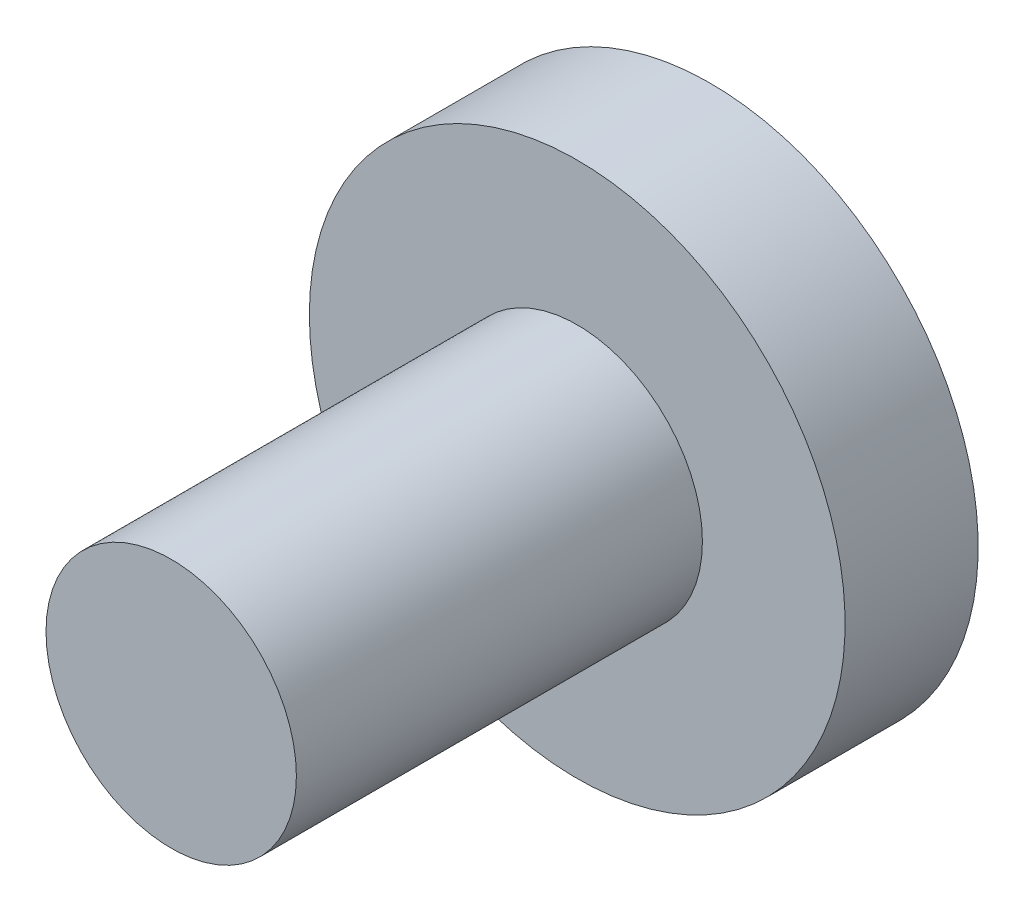
ISO-10303-21;
HEADER;
FILE_DESCRIPTION(('STEP AP214'),'2;1');
FILE_NAME('part.step','',(''),(''),'','','');
FILE_SCHEMA(('AUTOMOTIVE_DESIGN { 1 0 10303 214 1 1 1 1 }'));
ENDSEC;
DATA;
#1=APPLICATION_CONTEXT('core data for automotive mechanical design processes');
#2=APPLICATION_PROTOCOL_DEFINITION('international standard','automotive_design',2000,#1);
#3=PRODUCT_CONTEXT('',#1,'mechanical');
#4=PRODUCT('Part','Part','',(#3));
#5=PRODUCT_RELATED_PRODUCT_CATEGORY('part','',(#4));
#6=PRODUCT_DEFINITION_FORMATION('','',#4);
#7=PRODUCT_DEFINITION_CONTEXT('part definition',#1,'design');
#8=PRODUCT_DEFINITION('design','',#6,#7);
#9=PRODUCT_DEFINITION_SHAPE('','',#8);
#10=(LENGTH_UNIT() NAMED_UNIT(*) SI_UNIT(.MILLI.,.METRE.));
#11=(NAMED_UNIT(*) PLANE_ANGLE_UNIT() SI_UNIT($,.RADIAN.));
#12=(NAMED_UNIT(*) SI_UNIT($,.STERADIAN.) SOLID_ANGLE_UNIT());
#13=UNCERTAINTY_MEASURE_WITH_UNIT(LENGTH_MEASURE(1.E-05),#10,'distance_accuracy_value','');
#14=(GEOMETRIC_REPRESENTATION_CONTEXT(3) GLOBAL_UNCERTAINTY_ASSIGNED_CONTEXT((#13)) GLOBAL_UNIT_ASSIGNED_CONTEXT((#10,
#11,#12)) REPRESENTATION_CONTEXT('',''));
#15=CARTESIAN_POINT('',(0.,0.,0.));
#16=DIRECTION('',(0.,0.,1.));
#17=DIRECTION('',(1.,0.,0.));
#18=AXIS2_PLACEMENT_3D('',#15,#16,#17);
#19=CARTESIAN_POINT('',(-3.56925029485083,4.79469753857648,2.9972));
#20=DIRECTION('',(0.,0.,-1.));
#21=DIRECTION('',(-1.,0.,0.));
#22=AXIS2_PLACEMENT_3D('',#19,#20,#21);
#23=CYLINDRICAL_SURFACE('',#22,6.0325);
#24=CARTESIAN_POINT('',(-3.56925029485083,4.79469753857648,2.9972));
#25=DIRECTION('',(0.,0.,1.));
#26=DIRECTION('',(1.,0.,0.));
#27=AXIS2_PLACEMENT_3D('',#24,#25,#26);
#28=CIRCLE('',#27,6.0325);
#29=CARTESIAN_POINT('',(-9.60175029485083,4.79469753857648,2.9972));
#30=VERTEX_POINT('',#29);
#31=EDGE_CURVE('E10',#30,#30,#28,.T.);
#32=CARTESIAN_POINT('',(-3.56925029485083,4.79469753857648,0.));
#33=DIRECTION('',(0.,0.,1.));
#34=DIRECTION('',(1.,0.,0.));
#35=AXIS2_PLACEMENT_3D('',#32,#33,#34);
#36=CIRCLE('',#35,6.0325);
#37=CARTESIAN_POINT('',(-9.60175029485083,4.79469753857648,0.));
#38=VERTEX_POINT('',#37);
#39=EDGE_CURVE('E36',#38,#38,#36,.T.);
#40=CARTESIAN_POINT('',(-9.60175029485083,4.79469753857648,2.9972));
#41=CARTESIAN_POINT('',(-9.60175029485083,4.79469753857648,2.96597916666667));
#42=CARTESIAN_POINT('',(-9.60175029485083,4.79469753857648,2.93475833333333));
#43=CARTESIAN_POINT('',(-9.60175029485083,4.79469753857648,2.87231666666667));
#44=CARTESIAN_POINT('',(-9.60175029485083,4.79469753857648,2.84109583333333));
#45=CARTESIAN_POINT('',(-9.60175029485083,4.79469753857648,2.77865416666667));
#46=CARTESIAN_POINT('',(-9.60175029485083,4.79469753857648,2.74743333333333));
#47=CARTESIAN_POINT('',(-9.60175029485083,4.79469753857648,2.68499166666667));
#48=CARTESIAN_POINT('',(-9.60175029485083,4.79469753857648,2.65377083333333));
#49=CARTESIAN_POINT('',(-9.60175029485083,4.79469753857648,2.59132916666667));
#50=CARTESIAN_POINT('',(-9.60175029485083,4.79469753857648,2.56010833333333));
#51=CARTESIAN_POINT('',(-9.60175029485083,4.79469753857648,2.49766666666667));
#52=CARTESIAN_POINT('',(-9.60175029485083,4.79469753857648,2.46644583333333));
#53=CARTESIAN_POINT('',(-9.60175029485083,4.79469753857648,2.40400416666667));
#54=CARTESIAN_POINT('',(-9.60175029485083,4.79469753857648,2.37278333333333));
#55=CARTESIAN_POINT('',(-9.60175029485083,4.79469753857648,2.31034166666667));
#56=CARTESIAN_POINT('',(-9.60175029485083,4.79469753857648,2.27912083333333));
#57=CARTESIAN_POINT('',(-9.60175029485083,4.79469753857648,2.21667916666667));
#58=CARTESIAN_POINT('',(-9.60175029485083,4.79469753857648,2.18545833333333));
#59=CARTESIAN_POINT('',(-9.60175029485083,4.79469753857648,2.12301666666667));
#60=CARTESIAN_POINT('',(-9.60175029485083,4.79469753857648,2.09179583333333));
#61=CARTESIAN_POINT('',(-9.60175029485083,4.79469753857648,2.02935416666667));
#62=CARTESIAN_POINT('',(-9.60175029485083,4.79469753857648,1.99813333333333));
#63=CARTESIAN_POINT('',(-9.60175029485083,4.79469753857648,1.93569166666667));
#64=CARTESIAN_POINT('',(-9.60175029485083,4.79469753857648,1.90447083333333));
#65=CARTESIAN_POINT('',(-9.60175029485083,4.79469753857648,1.84202916666667));
#66=CARTESIAN_POINT('',(-9.60175029485083,4.79469753857648,1.81080833333333));
#67=CARTESIAN_POINT('',(-9.60175029485083,4.79469753857648,1.74836666666667));
#68=CARTESIAN_POINT('',(-9.60175029485083,4.79469753857648,1.71714583333333));
#69=CARTESIAN_POINT('',(-9.60175029485083,4.79469753857648,1.65470416666667));
#70=CARTESIAN_POINT('',(-9.60175029485083,4.79469753857648,1.62348333333333));
#71=CARTESIAN_POINT('',(-9.60175029485083,4.79469753857648,1.56104166666667));
#72=CARTESIAN_POINT('',(-9.60175029485083,4.79469753857648,1.52982083333333));
#73=CARTESIAN_POINT('',(-9.60175029485083,4.79469753857648,1.46737916666667));
#74=CARTESIAN_POINT('',(-9.60175029485083,4.79469753857648,1.43615833333333));
#75=CARTESIAN_POINT('',(-9.60175029485083,4.79469753857648,1.37371666666667));
#76=CARTESIAN_POINT('',(-9.60175029485083,4.79469753857648,1.34249583333333));
#77=CARTESIAN_POINT('',(-9.60175029485083,4.79469753857648,1.28005416666667));
#78=CARTESIAN_POINT('',(-9.60175029485083,4.79469753857648,1.24883333333333));
#79=CARTESIAN_POINT('',(-9.60175029485083,4.79469753857648,1.18639166666667));
#80=CARTESIAN_POINT('',(-9.60175029485083,4.79469753857648,1.15517083333333));
#81=CARTESIAN_POINT('',(-9.60175029485083,4.79469753857648,1.09272916666667));
#82=CARTESIAN_POINT('',(-9.60175029485083,4.79469753857648,1.06150833333333));
#83=CARTESIAN_POINT('',(-9.60175029485083,4.79469753857648,0.999066666666667));
#84=CARTESIAN_POINT('',(-9.60175029485083,4.79469753857648,0.967845833333333));
#85=CARTESIAN_POINT('',(-9.60175029485083,4.79469753857648,0.905404166666667));
#86=CARTESIAN_POINT('',(-9.60175029485083,4.79469753857648,0.874183333333333));
#87=CARTESIAN_POINT('',(-9.60175029485083,4.79469753857648,0.811741666666667));
#88=CARTESIAN_POINT('',(-9.60175029485083,4.79469753857648,0.780520833333333));
#89=CARTESIAN_POINT('',(-9.60175029485083,4.79469753857648,0.718079166666667));
#90=CARTESIAN_POINT('',(-9.60175029485083,4.79469753857648,0.686858333333333));
#91=CARTESIAN_POINT('',(-9.60175029485083,4.79469753857648,0.624416666666667));
#92=CARTESIAN_POINT('',(-9.60175029485083,4.79469753857648,0.593195833333333));
#93=CARTESIAN_POINT('',(-9.60175029485083,4.79469753857648,0.530754166666667));
#94=CARTESIAN_POINT('',(-9.60175029485083,4.79469753857648,0.499533333333333));
#95=CARTESIAN_POINT('',(-9.60175029485083,4.79469753857648,0.437091666666667));
#96=CARTESIAN_POINT('',(-9.60175029485083,4.79469753857648,0.405870833333333));
#97=CARTESIAN_POINT('',(-9.60175029485083,4.79469753857648,0.343429166666667));
#98=CARTESIAN_POINT('',(-9.60175029485083,4.79469753857648,0.312208333333333));
#99=CARTESIAN_POINT('',(-9.60175029485083,4.79469753857648,0.249766666666667));
#100=CARTESIAN_POINT('',(-9.60175029485083,4.79469753857648,0.218545833333333));
#101=CARTESIAN_POINT('',(-9.60175029485083,4.79469753857648,0.156104166666667));
#102=CARTESIAN_POINT('',(-9.60175029485083,4.79469753857648,0.124883333333333));
#103=CARTESIAN_POINT('',(-9.60175029485083,4.79469753857648,0.0624416666666668));
#104=CARTESIAN_POINT('',(-9.60175029485083,4.79469753857648,0.0312208333333333));
#105=CARTESIAN_POINT('',(-9.60175029485083,4.79469753857648,0.));
#106=B_SPLINE_CURVE_WITH_KNOTS('',3,(#40,#41,#42,#43,#44,#45,#46,#47,#48,#49,#50,#51,#52,#53,
#54,#55,#56,#57,#58,#59,#60,#61,#62,#63,#64,#65,#66,#67,#68,#69,#70,#71,#72,#73,#74,#75,#76,#77,
#78,#79,#80,#81,#82,#83,#84,#85,#86,#87,#88,#89,#90,#91,#92,#93,#94,#95,#96,#97,#98,#99,#100,
#101,#102,#103,#104,#105),.UNSPECIFIED.,.F.,.F.,(4,2,2,2,2,2,2,2,2,2,2,2,2,2,2,2,2,2,2,2,2,2,2,
2,2,2,2,2,2,2,2,2,4),(0.,0.0936625000000002,0.187325,0.2809875,0.37465,0.4683125,0.561975,
0.6556375,0.7493,0.8429625,0.936625,1.0302875,1.12395,1.2176125,1.311275,1.4049375,1.4986,
1.5922625,1.685925,1.7795875,1.87325,1.9669125,2.060575,2.1542375,2.2479,2.3415625,2.435225,
2.5288875,2.62255,2.7162125,2.809875,2.9035375,2.9972),.UNSPECIFIED.);
#107=EDGE_CURVE('BSEAM33',#30,#38,#106,.T.);
#108=ORIENTED_EDGE('',*,*,#31,.F.);
#109=ORIENTED_EDGE('',*,*,#39,.T.);
#110=ORIENTED_EDGE('',*,*,#107,.T.);
#111=ORIENTED_EDGE('',*,*,#107,.F.);
#112=EDGE_LOOP('',(#108,#110,#109,#111));
#113=FACE_BOUND('',#112,.T.);
#114=ADVANCED_FACE('F33',(#113),#23,.T.);
#115=CARTESIAN_POINT('',(-3.56925029485083,4.79469753857648,2.9972));
#116=DIRECTION('',(0.,0.,1.));
#117=DIRECTION('',(1.,0.,0.));
#118=AXIS2_PLACEMENT_3D('',#115,#116,#117);
#119=PLANE('',#118);
#120=CARTESIAN_POINT('',(-3.56925029485083,4.79469753857648,2.9972));
#121=DIRECTION('',(0.,0.,1.));
#122=DIRECTION('',(1.,0.,0.));
#123=AXIS2_PLACEMENT_3D('',#120,#121,#122);
#124=CIRCLE('',#123,2.8194);
#125=CARTESIAN_POINT('',(-0.749850294850829,4.79469753857648,2.9972));
#126=VERTEX_POINT('',#125);
#127=EDGE_CURVE('E45',#126,#126,#124,.T.);
#128=ORIENTED_EDGE('',*,*,#127,.F.);
#129=EDGE_LOOP('',(#128));
#130=FACE_BOUND('',#129,.T.);
#131=ORIENTED_EDGE('',*,*,#31,.T.);
#132=EDGE_LOOP('',(#131));
#133=FACE_BOUND('',#132,.T.);
#134=ADVANCED_FACE('F60',(#130,#133),#119,.T.);
#135=CARTESIAN_POINT('',(-3.56925029485083,4.79469753857648,0.));
#136=DIRECTION('',(0.,0.,1.));
#137=DIRECTION('',(1.,0.,0.));
#138=AXIS2_PLACEMENT_3D('',#135,#136,#137);
#139=PLANE('',#138);
#140=ORIENTED_EDGE('',*,*,#39,.F.);
#141=EDGE_LOOP('',(#140));
#142=FACE_BOUND('',#141,.T.);
#143=ADVANCED_FACE('F56',(#142),#139,.F.);
#144=CARTESIAN_POINT('',(-3.56925029485083,4.79469753857648,12.1412));
#145=DIRECTION('',(0.,0.,-1.));
#146=DIRECTION('',(-1.,0.,0.));
#147=AXIS2_PLACEMENT_3D('',#144,#145,#146);
#148=CYLINDRICAL_SURFACE('',#147,2.8194);
#149=CARTESIAN_POINT('',(-3.56925029485083,4.79469753857648,12.1412));
#150=DIRECTION('',(0.,0.,1.));
#151=DIRECTION('',(1.,0.,0.));
#152=AXIS2_PLACEMENT_3D('',#149,#150,#151);
#153=CIRCLE('',#152,2.8194);
#154=CARTESIAN_POINT('',(-0.749850294850829,4.79469753857648,12.1412));
#155=VERTEX_POINT('',#154);
#156=EDGE_CURVE('E43',#155,#155,#153,.T.);
#157=ORIENTED_EDGE('',*,*,#156,.F.);
#158=EDGE_LOOP('',(#157));
#159=FACE_BOUND('',#158,.T.);
#160=ORIENTED_EDGE('',*,*,#127,.T.);
#161=EDGE_LOOP('',(#160));
#162=FACE_BOUND('',#161,.T.);
#163=ADVANCED_FACE('F53',(#159,#162),#148,.T.);
#164=CARTESIAN_POINT('',(-3.56925029485083,4.79469753857648,12.1412));
#165=DIRECTION('',(0.,0.,1.));
#166=DIRECTION('',(1.,0.,0.));
#167=AXIS2_PLACEMENT_3D('',#164,#165,#166);
#168=PLANE('',#167);
#169=ORIENTED_EDGE('',*,*,#156,.T.);
#170=EDGE_LOOP('',(#169));
#171=FACE_BOUND('',#170,.T.);
#172=ADVANCED_FACE('F51',(#171),#168,.T.);
#173=CLOSED_SHELL('',(#114,#134,#143,#163,#172));
#174=MANIFOLD_SOLID_BREP('B2',#173);
#175=ADVANCED_BREP_SHAPE_REPRESENTATION('',(#18,#174),#14);
#176=SHAPE_DEFINITION_REPRESENTATION(#9,#175);
ENDSEC;
END-ISO-10303-21;
